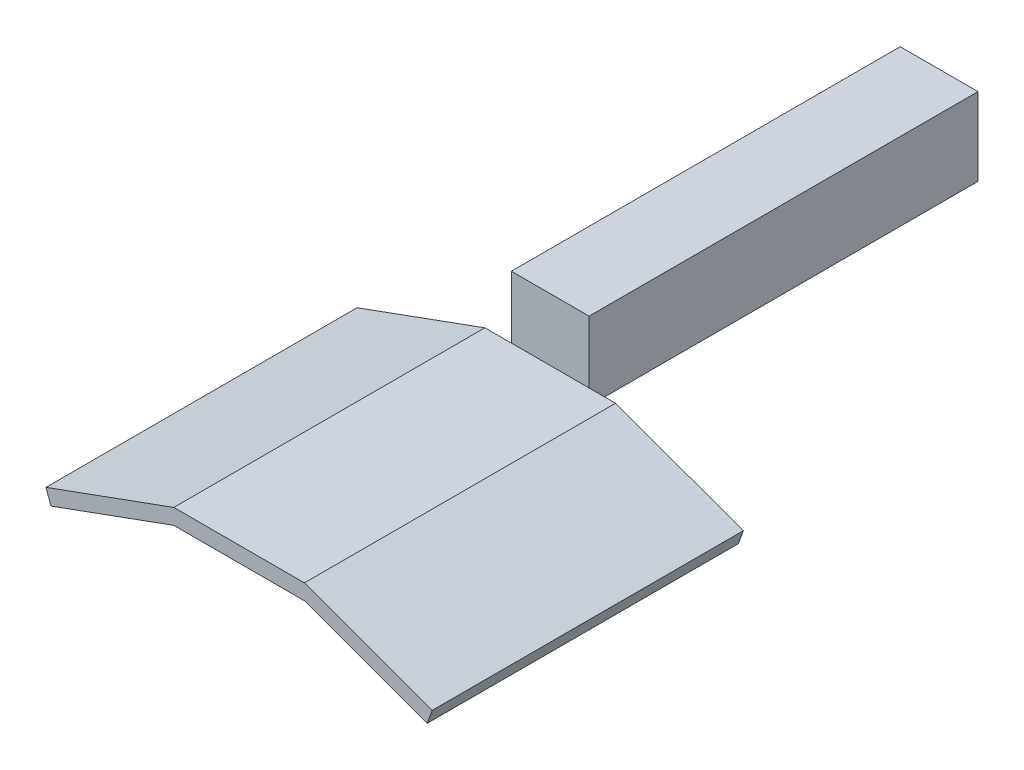
ISO-10303-21;
HEADER;
FILE_DESCRIPTION(('STEP AP214'),'2;1');
FILE_NAME('part.step','',(''),(''),'','','');
FILE_SCHEMA(('AUTOMOTIVE_DESIGN { 1 0 10303 214 1 1 1 1 }'));
ENDSEC;
DATA;
#1=APPLICATION_CONTEXT('core data for automotive mechanical design processes');
#2=APPLICATION_PROTOCOL_DEFINITION('international standard','automotive_design',2000,#1);
#3=PRODUCT_CONTEXT('',#1,'mechanical');
#4=PRODUCT('Part','Part','',(#3));
#5=PRODUCT_RELATED_PRODUCT_CATEGORY('part','',(#4));
#6=PRODUCT_DEFINITION_FORMATION('','',#4);
#7=PRODUCT_DEFINITION_CONTEXT('part definition',#1,'design');
#8=PRODUCT_DEFINITION('design','',#6,#7);
#9=PRODUCT_DEFINITION_SHAPE('','',#8);
#10=(LENGTH_UNIT() NAMED_UNIT(*) SI_UNIT(.MILLI.,.METRE.));
#11=(NAMED_UNIT(*) PLANE_ANGLE_UNIT() SI_UNIT($,.RADIAN.));
#12=(NAMED_UNIT(*) SI_UNIT($,.STERADIAN.) SOLID_ANGLE_UNIT());
#13=UNCERTAINTY_MEASURE_WITH_UNIT(LENGTH_MEASURE(1.E-05),#10,'distance_accuracy_value','');
#14=(GEOMETRIC_REPRESENTATION_CONTEXT(3) GLOBAL_UNCERTAINTY_ASSIGNED_CONTEXT((#13)) GLOBAL_UNIT_ASSIGNED_CONTEXT((#10,
#11,#12)) REPRESENTATION_CONTEXT('',''));
#15=CARTESIAN_POINT('',(0.,0.,0.));
#16=DIRECTION('',(0.,0.,1.));
#17=DIRECTION('',(1.,0.,0.));
#18=AXIS2_PLACEMENT_3D('',#15,#16,#17);
#19=CARTESIAN_POINT('',(0.,0.,500.));
#20=DIRECTION('',(0.,0.,-1.));
#21=DIRECTION('',(-1.,0.,0.));
#22=AXIS2_PLACEMENT_3D('',#19,#20,#21);
#23=PLANE('',#22);
#24=DIRECTION('',(-1.,0.,0.));
#25=VECTOR('',#24,1.);
#26=CARTESIAN_POINT('',(-34.,20.,500.));
#27=LINE('',#26,#25);
#28=CARTESIAN_POINT('',(100.,20.,500.));
#29=VERTEX_POINT('',#28);
#30=CARTESIAN_POINT('',(0.,20.,500.));
#31=VERTEX_POINT('',#30);
#32=EDGE_CURVE('E11',#29,#31,#27,.T.);
#33=ORIENTED_EDGE('',*,*,#32,.F.);
#34=DIRECTION('',(0.,1.,0.));
#35=VECTOR('',#34,1.);
#36=CARTESIAN_POINT('',(100.,0.,500.));
#37=LINE('',#36,#35);
#38=CARTESIAN_POINT('',(100.,100.,500.));
#39=VERTEX_POINT('',#38);
#40=EDGE_CURVE('E252',#29,#39,#37,.T.);
#41=ORIENTED_EDGE('',*,*,#40,.T.);
#42=DIRECTION('',(-1.,0.,0.));
#43=VECTOR('',#42,1.);
#44=CARTESIAN_POINT('',(0.,100.,500.));
#45=LINE('',#44,#43);
#46=CARTESIAN_POINT('',(0.,100.,500.));
#47=VERTEX_POINT('',#46);
#48=EDGE_CURVE('E68',#39,#47,#45,.T.);
#49=ORIENTED_EDGE('',*,*,#48,.T.);
#50=DIRECTION('',(0.,-1.,0.));
#51=VECTOR('',#50,1.);
#52=CARTESIAN_POINT('',(0.,0.,500.));
#53=LINE('',#52,#51);
#54=EDGE_CURVE('E249',#47,#31,#53,.T.);
#55=ORIENTED_EDGE('',*,*,#54,.T.);
#56=EDGE_LOOP('',(#33,#41,#49,#55));
#57=FACE_BOUND('',#56,.T.);
#58=ADVANCED_FACE('F45',(#57),#23,.F.);
#59=CARTESIAN_POINT('',(0.,0.,500.));
#60=DIRECTION('',(1.,0.,0.));
#61=DIRECTION('',(0.,0.,-1.));
#62=AXIS2_PLACEMENT_3D('',#59,#60,#61);
#63=PLANE('',#62);
#64=DIRECTION('',(0.,-1.,0.));
#65=VECTOR('',#64,1.);
#66=CARTESIAN_POINT('',(0.,0.,0.));
#67=LINE('',#66,#65);
#68=CARTESIAN_POINT('',(0.,100.,0.));
#69=VERTEX_POINT('',#68);
#70=CARTESIAN_POINT('',(0.,0.,0.));
#71=VERTEX_POINT('',#70);
#72=EDGE_CURVE('E248',#69,#71,#67,.T.);
#73=ORIENTED_EDGE('',*,*,#72,.T.);
#74=DIRECTION('',(0.,0.,-1.));
#75=VECTOR('',#74,1.);
#76=CARTESIAN_POINT('',(0.,0.,500.));
#77=LINE('',#76,#75);
#78=CARTESIAN_POINT('',(0.,0.,500.));
#79=VERTEX_POINT('',#78);
#80=EDGE_CURVE('E49',#79,#71,#77,.T.);
#81=ORIENTED_EDGE('',*,*,#80,.F.);
#82=EDGE_CURVE('E253',#31,#79,#53,.T.);
#83=ORIENTED_EDGE('',*,*,#82,.F.);
#84=ORIENTED_EDGE('',*,*,#54,.F.);
#85=DIRECTION('',(0.,0.,-1.));
#86=VECTOR('',#85,1.);
#87=CARTESIAN_POINT('',(0.,100.,500.));
#88=LINE('',#87,#86);
#89=EDGE_CURVE('E260',#47,#69,#88,.T.);
#90=ORIENTED_EDGE('',*,*,#89,.T.);
#91=EDGE_LOOP('',(#73,#81,#83,#84,#90));
#92=FACE_BOUND('',#91,.T.);
#93=ADVANCED_FACE('F47',(#92),#63,.F.);
#94=CARTESIAN_POINT('',(0.,0.,500.));
#95=DIRECTION('',(0.,1.,0.));
#96=DIRECTION('',(0.,0.,1.));
#97=AXIS2_PLACEMENT_3D('',#94,#95,#96);
#98=PLANE('',#97);
#99=DIRECTION('',(1.,0.,0.));
#100=VECTOR('',#99,1.);
#101=CARTESIAN_POINT('',(0.,0.,0.));
#102=LINE('',#101,#100);
#103=CARTESIAN_POINT('',(100.,0.,0.));
#104=VERTEX_POINT('',#103);
#105=EDGE_CURVE('E263',#71,#104,#102,.T.);
#106=ORIENTED_EDGE('',*,*,#105,.T.);
#107=DIRECTION('',(0.,0.,-1.));
#108=VECTOR('',#107,1.);
#109=CARTESIAN_POINT('',(100.,0.,500.));
#110=LINE('',#109,#108);
#111=CARTESIAN_POINT('',(100.,0.,500.));
#112=VERTEX_POINT('',#111);
#113=EDGE_CURVE('E275',#112,#104,#110,.T.);
#114=ORIENTED_EDGE('',*,*,#113,.F.);
#115=DIRECTION('',(1.,0.,0.));
#116=VECTOR('',#115,1.);
#117=CARTESIAN_POINT('',(-34.,0.,500.));
#118=LINE('',#117,#116);
#119=CARTESIAN_POINT('',(134.,0.,500.));
#120=VERTEX_POINT('',#119);
#121=EDGE_CURVE('E220',#112,#120,#118,.T.);
#122=ORIENTED_EDGE('',*,*,#121,.T.);
#123=DIRECTION('',(0.,0.,-1.));
#124=VECTOR('',#123,1.);
#125=CARTESIAN_POINT('',(134.,0.,900.));
#126=LINE('',#125,#124);
#127=CARTESIAN_POINT('',(134.,0.,900.));
#128=VERTEX_POINT('',#127);
#129=EDGE_CURVE('E240',#128,#120,#126,.T.);
#130=ORIENTED_EDGE('',*,*,#129,.F.);
#131=DIRECTION('',(1.,0.,0.));
#132=VECTOR('',#131,1.);
#133=CARTESIAN_POINT('',(-34.,0.,900.));
#134=LINE('',#133,#132);
#135=CARTESIAN_POINT('',(-34.,0.,900.));
#136=VERTEX_POINT('',#135);
#137=EDGE_CURVE('E223',#136,#128,#134,.T.);
#138=ORIENTED_EDGE('',*,*,#137,.F.);
#139=DIRECTION('',(0.,0.,-1.));
#140=VECTOR('',#139,1.);
#141=CARTESIAN_POINT('',(-34.,0.,900.));
#142=LINE('',#141,#140);
#143=CARTESIAN_POINT('',(-34.,0.,500.));
#144=VERTEX_POINT('',#143);
#145=EDGE_CURVE('E244',#136,#144,#142,.T.);
#146=ORIENTED_EDGE('',*,*,#145,.T.);
#147=EDGE_CURVE('E229',#144,#79,#118,.T.);
#148=ORIENTED_EDGE('',*,*,#147,.T.);
#149=ORIENTED_EDGE('',*,*,#80,.T.);
#150=EDGE_LOOP('',(#106,#114,#122,#130,#138,#146,#148,#149));
#151=FACE_BOUND('',#150,.T.);
#152=ADVANCED_FACE('F283',(#151),#98,.F.);
#153=CARTESIAN_POINT('',(100.,0.,500.));
#154=DIRECTION('',(-1.,0.,0.));
#155=DIRECTION('',(0.,0.,1.));
#156=AXIS2_PLACEMENT_3D('',#153,#154,#155);
#157=PLANE('',#156);
#158=DIRECTION('',(0.,1.,0.));
#159=VECTOR('',#158,1.);
#160=CARTESIAN_POINT('',(100.,0.,0.));
#161=LINE('',#160,#159);
#162=CARTESIAN_POINT('',(100.,100.,0.));
#163=VERTEX_POINT('',#162);
#164=EDGE_CURVE('E266',#104,#163,#161,.T.);
#165=ORIENTED_EDGE('',*,*,#164,.T.);
#166=DIRECTION('',(0.,0.,-1.));
#167=VECTOR('',#166,1.);
#168=CARTESIAN_POINT('',(100.,100.,500.));
#169=LINE('',#168,#167);
#170=EDGE_CURVE('E273',#39,#163,#169,.T.);
#171=ORIENTED_EDGE('',*,*,#170,.F.);
#172=ORIENTED_EDGE('',*,*,#40,.F.);
#173=EDGE_CURVE('E254',#112,#29,#37,.T.);
#174=ORIENTED_EDGE('',*,*,#173,.F.);
#175=ORIENTED_EDGE('',*,*,#113,.T.);
#176=EDGE_LOOP('',(#165,#171,#172,#174,#175));
#177=FACE_BOUND('',#176,.T.);
#178=ADVANCED_FACE('F289',(#177),#157,.F.);
#179=CARTESIAN_POINT('',(0.,100.,500.));
#180=DIRECTION('',(0.,-1.,0.));
#181=DIRECTION('',(0.,0.,-1.));
#182=AXIS2_PLACEMENT_3D('',#179,#180,#181);
#183=PLANE('',#182);
#184=DIRECTION('',(-1.,0.,0.));
#185=VECTOR('',#184,1.);
#186=CARTESIAN_POINT('',(0.,100.,0.));
#187=LINE('',#186,#185);
#188=EDGE_CURVE('E89',#163,#69,#187,.T.);
#189=ORIENTED_EDGE('',*,*,#188,.T.);
#190=ORIENTED_EDGE('',*,*,#89,.F.);
#191=ORIENTED_EDGE('',*,*,#48,.F.);
#192=ORIENTED_EDGE('',*,*,#170,.T.);
#193=EDGE_LOOP('',(#189,#190,#191,#192));
#194=FACE_BOUND('',#193,.T.);
#195=ADVANCED_FACE('F290',(#194),#183,.F.);
#196=CARTESIAN_POINT('',(0.,0.,0.));
#197=DIRECTION('',(0.,0.,-1.));
#198=DIRECTION('',(-1.,0.,0.));
#199=AXIS2_PLACEMENT_3D('',#196,#197,#198);
#200=PLANE('',#199);
#201=ORIENTED_EDGE('',*,*,#72,.F.);
#202=ORIENTED_EDGE('',*,*,#188,.F.);
#203=ORIENTED_EDGE('',*,*,#164,.F.);
#204=ORIENTED_EDGE('',*,*,#105,.F.);
#205=EDGE_LOOP('',(#201,#202,#203,#204));
#206=FACE_BOUND('',#205,.T.);
#207=ADVANCED_FACE('F287',(#206),#200,.T.);
#208=CARTESIAN_POINT('',(0.,0.,500.));
#209=DIRECTION('',(0.,0.,-1.));
#210=DIRECTION('',(-1.,0.,0.));
#211=AXIS2_PLACEMENT_3D('',#208,#209,#210);
#212=PLANE('',#211);
#213=CARTESIAN_POINT('',(-34.,20.,500.));
#214=VERTEX_POINT('',#213);
#215=EDGE_CURVE('E57',#31,#214,#27,.T.);
#216=ORIENTED_EDGE('',*,*,#215,.F.);
#217=ORIENTED_EDGE('',*,*,#82,.T.);
#218=ORIENTED_EDGE('',*,*,#147,.F.);
#219=DIRECTION('',(0.93969262078591,0.342020143325663,0.));
#220=VECTOR('',#219,1.);
#221=CARTESIAN_POINT('',(-34.,0.,500.));
#222=LINE('',#221,#220);
#223=CARTESIAN_POINT('',(-191.868360292033,-57.4593840787114,500.));
#224=VERTEX_POINT('',#223);
#225=EDGE_CURVE('E185',#224,#144,#222,.T.);
#226=ORIENTED_EDGE('',*,*,#225,.F.);
#227=DIRECTION('',(0.342020143325663,-0.939692620785911,0.));
#228=VECTOR('',#227,1.);
#229=CARTESIAN_POINT('',(-191.868360292033,-57.4593840787114,500.));
#230=LINE('',#229,#228);
#231=CARTESIAN_POINT('',(-198.296236388898,-39.7989396475215,500.));
#232=VERTEX_POINT('',#231);
#233=EDGE_CURVE('E180',#232,#224,#230,.T.);
#234=ORIENTED_EDGE('',*,*,#233,.F.);
#235=DIRECTION('',(-0.93969262078591,-0.342020143325663,0.));
#236=VECTOR('',#235,1.);
#237=CARTESIAN_POINT('',(-198.296236388898,-39.7989396475215,500.));
#238=LINE('',#237,#236);
#239=EDGE_CURVE('E158',#214,#232,#238,.T.);
#240=ORIENTED_EDGE('',*,*,#239,.F.);
#241=EDGE_LOOP('',(#216,#217,#218,#226,#234,#240));
#242=FACE_BOUND('',#241,.T.);
#243=ADVANCED_FACE('F303',(#242),#212,.T.);
#244=CARTESIAN_POINT('',(-34.,20.,900.));
#245=DIRECTION('',(0.,-1.,0.));
#246=DIRECTION('',(0.,0.,-1.));
#247=AXIS2_PLACEMENT_3D('',#244,#245,#246);
#248=PLANE('',#247);
#249=CARTESIAN_POINT('',(134.,20.,500.));
#250=VERTEX_POINT('',#249);
#251=EDGE_CURVE('E56',#250,#29,#27,.T.);
#252=ORIENTED_EDGE('',*,*,#251,.T.);
#253=ORIENTED_EDGE('',*,*,#32,.T.);
#254=ORIENTED_EDGE('',*,*,#215,.T.);
#255=DIRECTION('',(0.,0.,-1.));
#256=VECTOR('',#255,1.);
#257=CARTESIAN_POINT('',(-34.,20.,900.));
#258=LINE('',#257,#256);
#259=CARTESIAN_POINT('',(-34.,20.,900.));
#260=VERTEX_POINT('',#259);
#261=EDGE_CURVE('E228',#260,#214,#258,.T.);
#262=ORIENTED_EDGE('',*,*,#261,.F.);
#263=DIRECTION('',(-1.,0.,0.));
#264=VECTOR('',#263,1.);
#265=CARTESIAN_POINT('',(-34.,20.,900.));
#266=LINE('',#265,#264);
#267=CARTESIAN_POINT('',(134.,20.,900.));
#268=VERTEX_POINT('',#267);
#269=EDGE_CURVE('E177',#268,#260,#266,.T.);
#270=ORIENTED_EDGE('',*,*,#269,.F.);
#271=DIRECTION('',(0.,0.,-1.));
#272=VECTOR('',#271,1.);
#273=CARTESIAN_POINT('',(134.,20.,900.));
#274=LINE('',#273,#272);
#275=EDGE_CURVE('E237',#268,#250,#274,.T.);
#276=ORIENTED_EDGE('',*,*,#275,.T.);
#277=EDGE_LOOP('',(#252,#253,#254,#262,#270,#276));
#278=FACE_BOUND('',#277,.T.);
#279=ADVANCED_FACE('F300',(#278),#248,.F.);
#280=CARTESIAN_POINT('',(0.,0.,900.));
#281=DIRECTION('',(0.,0.,-1.));
#282=DIRECTION('',(-1.,0.,0.));
#283=AXIS2_PLACEMENT_3D('',#280,#281,#282);
#284=PLANE('',#283);
#285=ORIENTED_EDGE('',*,*,#269,.T.);
#286=DIRECTION('',(-0.93969262078591,-0.342020143325663,0.));
#287=VECTOR('',#286,1.);
#288=CARTESIAN_POINT('',(-198.296236388898,-39.7989396475215,900.));
#289=LINE('',#288,#287);
#290=CARTESIAN_POINT('',(-198.296236388898,-39.7989396475215,900.));
#291=VERTEX_POINT('',#290);
#292=EDGE_CURVE('E156',#260,#291,#289,.T.);
#293=ORIENTED_EDGE('',*,*,#292,.T.);
#294=DIRECTION('',(0.342020143325663,-0.939692620785911,0.));
#295=VECTOR('',#294,1.);
#296=CARTESIAN_POINT('',(-191.868360292033,-57.4593840787114,900.));
#297=LINE('',#296,#295);
#298=CARTESIAN_POINT('',(-191.868360292033,-57.4593840787114,900.));
#299=VERTEX_POINT('',#298);
#300=EDGE_CURVE('E166',#291,#299,#297,.T.);
#301=ORIENTED_EDGE('',*,*,#300,.T.);
#302=DIRECTION('',(0.93969262078591,0.342020143325663,0.));
#303=VECTOR('',#302,1.);
#304=CARTESIAN_POINT('',(-34.,0.,900.));
#305=LINE('',#304,#303);
#306=EDGE_CURVE('E173',#299,#136,#305,.T.);
#307=ORIENTED_EDGE('',*,*,#306,.T.);
#308=ORIENTED_EDGE('',*,*,#137,.T.);
#309=DIRECTION('',(0.93969262078591,-0.342020143325663,0.));
#310=VECTOR('',#309,1.);
#311=CARTESIAN_POINT('',(134.,0.,900.));
#312=LINE('',#311,#310);
#313=CARTESIAN_POINT('',(291.868360292033,-57.4593840787114,900.));
#314=VERTEX_POINT('',#313);
#315=EDGE_CURVE('E172',#128,#314,#312,.T.);
#316=ORIENTED_EDGE('',*,*,#315,.T.);
#317=DIRECTION('',(0.342020143325663,0.939692620785911,0.));
#318=VECTOR('',#317,1.);
#319=CARTESIAN_POINT('',(291.868360292033,-57.4593840787114,900.));
#320=LINE('',#319,#318);
#321=CARTESIAN_POINT('',(298.296236388898,-39.7989396475215,900.));
#322=VERTEX_POINT('',#321);
#323=EDGE_CURVE('E211',#314,#322,#320,.T.);
#324=ORIENTED_EDGE('',*,*,#323,.T.);
#325=DIRECTION('',(-0.93969262078591,0.342020143325663,0.));
#326=VECTOR('',#325,1.);
#327=CARTESIAN_POINT('',(298.296236388898,-39.7989396475215,900.));
#328=LINE('',#327,#326);
#329=EDGE_CURVE('E199',#322,#268,#328,.T.);
#330=ORIENTED_EDGE('',*,*,#329,.T.);
#331=EDGE_LOOP('',(#285,#293,#301,#307,#308,#316,#324,#330));
#332=FACE_BOUND('',#331,.T.);
#333=ADVANCED_FACE('F175',(#332),#284,.F.);
#334=ORIENTED_EDGE('',*,*,#121,.F.);
#335=ORIENTED_EDGE('',*,*,#173,.T.);
#336=ORIENTED_EDGE('',*,*,#251,.F.);
#337=DIRECTION('',(-0.93969262078591,0.342020143325663,0.));
#338=VECTOR('',#337,1.);
#339=CARTESIAN_POINT('',(298.296236388898,-39.7989396475215,500.));
#340=LINE('',#339,#338);
#341=CARTESIAN_POINT('',(298.296236388898,-39.7989396475215,500.));
#342=VERTEX_POINT('',#341);
#343=EDGE_CURVE('E203',#342,#250,#340,.T.);
#344=ORIENTED_EDGE('',*,*,#343,.F.);
#345=DIRECTION('',(0.342020143325663,0.939692620785911,0.));
#346=VECTOR('',#345,1.);
#347=CARTESIAN_POINT('',(291.868360292033,-57.4593840787114,500.));
#348=LINE('',#347,#346);
#349=CARTESIAN_POINT('',(291.868360292033,-57.4593840787114,500.));
#350=VERTEX_POINT('',#349);
#351=EDGE_CURVE('E198',#350,#342,#348,.T.);
#352=ORIENTED_EDGE('',*,*,#351,.F.);
#353=DIRECTION('',(0.93969262078591,-0.342020143325663,0.));
#354=VECTOR('',#353,1.);
#355=CARTESIAN_POINT('',(134.,0.,500.));
#356=LINE('',#355,#354);
#357=EDGE_CURVE('E194',#120,#350,#356,.T.);
#358=ORIENTED_EDGE('',*,*,#357,.F.);
#359=EDGE_LOOP('',(#334,#335,#336,#344,#352,#358));
#360=FACE_BOUND('',#359,.T.);
#361=ADVANCED_FACE('F322',(#360),#212,.T.);
#362=CARTESIAN_POINT('',(298.296236388898,-39.7989396475215,500.));
#363=DIRECTION('',(0.342020143325663,0.93969262078591,0.));
#364=DIRECTION('',(-0.939692620785911,0.342020143325663,0.));
#365=AXIS2_PLACEMENT_3D('',#362,#363,#364);
#366=PLANE('',#365);
#367=ORIENTED_EDGE('',*,*,#329,.F.);
#368=DIRECTION('',(0.,0.,1.));
#369=VECTOR('',#368,1.);
#370=CARTESIAN_POINT('',(298.296236388898,-39.7989396475215,500.));
#371=LINE('',#370,#369);
#372=EDGE_CURVE('E217',#342,#322,#371,.T.);
#373=ORIENTED_EDGE('',*,*,#372,.F.);
#374=ORIENTED_EDGE('',*,*,#343,.T.);
#375=ORIENTED_EDGE('',*,*,#275,.F.);
#376=EDGE_LOOP('',(#367,#373,#374,#375));
#377=FACE_BOUND('',#376,.T.);
#378=ADVANCED_FACE('F344',(#377),#366,.T.);
#379=CARTESIAN_POINT('',(291.868360292033,-57.4593840787114,500.));
#380=DIRECTION('',(0.939692620785911,-0.342020143325663,0.));
#381=DIRECTION('',(0.342020143325663,0.939692620785911,0.));
#382=AXIS2_PLACEMENT_3D('',#379,#380,#381);
#383=PLANE('',#382);
#384=ORIENTED_EDGE('',*,*,#323,.F.);
#385=DIRECTION('',(0.,0.,1.));
#386=VECTOR('',#385,1.);
#387=CARTESIAN_POINT('',(291.868360292033,-57.4593840787114,500.));
#388=LINE('',#387,#386);
#389=EDGE_CURVE('E207',#350,#314,#388,.T.);
#390=ORIENTED_EDGE('',*,*,#389,.F.);
#391=ORIENTED_EDGE('',*,*,#351,.T.);
#392=ORIENTED_EDGE('',*,*,#372,.T.);
#393=EDGE_LOOP('',(#384,#390,#391,#392));
#394=FACE_BOUND('',#393,.T.);
#395=ADVANCED_FACE('F351',(#394),#383,.T.);
#396=CARTESIAN_POINT('',(134.,0.,500.));
#397=DIRECTION('',(-0.342020143325663,-0.93969262078591,0.));
#398=DIRECTION('',(0.939692620785911,-0.342020143325663,0.));
#399=AXIS2_PLACEMENT_3D('',#396,#397,#398);
#400=PLANE('',#399);
#401=ORIENTED_EDGE('',*,*,#315,.F.);
#402=ORIENTED_EDGE('',*,*,#129,.T.);
#403=ORIENTED_EDGE('',*,*,#357,.T.);
#404=ORIENTED_EDGE('',*,*,#389,.T.);
#405=EDGE_LOOP('',(#401,#402,#403,#404));
#406=FACE_BOUND('',#405,.T.);
#407=ADVANCED_FACE('F360',(#406),#400,.T.);
#408=CARTESIAN_POINT('',(-191.868360292033,-57.4593840787114,500.));
#409=DIRECTION('',(-0.939692620785911,-0.342020143325663,0.));
#410=DIRECTION('',(0.342020143325663,-0.939692620785911,0.));
#411=AXIS2_PLACEMENT_3D('',#408,#409,#410);
#412=PLANE('',#411);
#413=ORIENTED_EDGE('',*,*,#300,.F.);
#414=DIRECTION('',(0.,0.,1.));
#415=VECTOR('',#414,1.);
#416=CARTESIAN_POINT('',(-198.296236388898,-39.7989396475215,500.));
#417=LINE('',#416,#415);
#418=EDGE_CURVE('E151',#232,#291,#417,.T.);
#419=ORIENTED_EDGE('',*,*,#418,.F.);
#420=ORIENTED_EDGE('',*,*,#233,.T.);
#421=DIRECTION('',(0.,0.,1.));
#422=VECTOR('',#421,1.);
#423=CARTESIAN_POINT('',(-191.868360292033,-57.4593840787114,500.));
#424=LINE('',#423,#422);
#425=EDGE_CURVE('E163',#224,#299,#424,.T.);
#426=ORIENTED_EDGE('',*,*,#425,.T.);
#427=EDGE_LOOP('',(#413,#419,#420,#426));
#428=FACE_BOUND('',#427,.T.);
#429=ADVANCED_FACE('F167',(#428),#412,.T.);
#430=CARTESIAN_POINT('',(-198.296236388898,-39.7989396475215,500.));
#431=DIRECTION('',(-0.342020143325663,0.93969262078591,0.));
#432=DIRECTION('',(-0.939692620785911,-0.342020143325663,0.));
#433=AXIS2_PLACEMENT_3D('',#430,#431,#432);
#434=PLANE('',#433);
#435=ORIENTED_EDGE('',*,*,#292,.F.);
#436=ORIENTED_EDGE('',*,*,#261,.T.);
#437=ORIENTED_EDGE('',*,*,#239,.T.);
#438=ORIENTED_EDGE('',*,*,#418,.T.);
#439=EDGE_LOOP('',(#435,#436,#437,#438));
#440=FACE_BOUND('',#439,.T.);
#441=ADVANCED_FACE('F153',(#440),#434,.T.);
#442=CARTESIAN_POINT('',(-34.,0.,500.));
#443=DIRECTION('',(0.342020143325663,-0.93969262078591,0.));
#444=DIRECTION('',(0.939692620785911,0.342020143325663,0.));
#445=AXIS2_PLACEMENT_3D('',#442,#443,#444);
#446=PLANE('',#445);
#447=ORIENTED_EDGE('',*,*,#306,.F.);
#448=ORIENTED_EDGE('',*,*,#425,.F.);
#449=ORIENTED_EDGE('',*,*,#225,.T.);
#450=ORIENTED_EDGE('',*,*,#145,.F.);
#451=EDGE_LOOP('',(#447,#448,#449,#450));
#452=FACE_BOUND('',#451,.T.);
#453=ADVANCED_FACE('F384',(#452),#446,.T.);
#454=CLOSED_SHELL('',(#58,#93,#152,#178,#195,#207,#243,#279,#333,#361,#378,#395,#407,#429,#441,#453));
#455=MANIFOLD_SOLID_BREP('B2',#454);
#456=ADVANCED_BREP_SHAPE_REPRESENTATION('',(#18,#455),#14);
#457=SHAPE_DEFINITION_REPRESENTATION(#9,#456);
ENDSEC;
END-ISO-10303-21;
